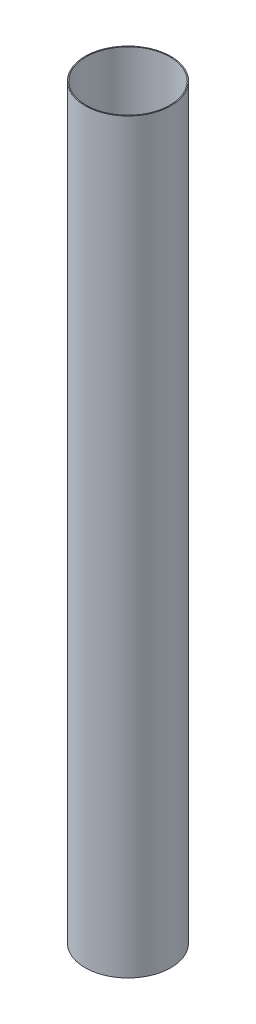
ISO-10303-21;
HEADER;
FILE_DESCRIPTION(('STEP AP214'),'2;1');
FILE_NAME('part.step','',(''),(''),'','','');
FILE_SCHEMA(('AUTOMOTIVE_DESIGN { 1 0 10303 214 1 1 1 1 }'));
ENDSEC;
DATA;
#1=APPLICATION_CONTEXT('core data for automotive mechanical design processes');
#2=APPLICATION_PROTOCOL_DEFINITION('international standard','automotive_design',2000,#1);
#3=PRODUCT_CONTEXT('',#1,'mechanical');
#4=PRODUCT('Part','Part','',(#3));
#5=PRODUCT_RELATED_PRODUCT_CATEGORY('part','',(#4));
#6=PRODUCT_DEFINITION_FORMATION('','',#4);
#7=PRODUCT_DEFINITION_CONTEXT('part definition',#1,'design');
#8=PRODUCT_DEFINITION('design','',#6,#7);
#9=PRODUCT_DEFINITION_SHAPE('','',#8);
#10=(LENGTH_UNIT() NAMED_UNIT(*) SI_UNIT(.MILLI.,.METRE.));
#11=(NAMED_UNIT(*) PLANE_ANGLE_UNIT() SI_UNIT($,.RADIAN.));
#12=(NAMED_UNIT(*) SI_UNIT($,.STERADIAN.) SOLID_ANGLE_UNIT());
#13=UNCERTAINTY_MEASURE_WITH_UNIT(LENGTH_MEASURE(1.E-05),#10,'distance_accuracy_value','');
#14=(GEOMETRIC_REPRESENTATION_CONTEXT(3) GLOBAL_UNCERTAINTY_ASSIGNED_CONTEXT((#13)) GLOBAL_UNIT_ASSIGNED_CONTEXT((#10,
#11,#12)) REPRESENTATION_CONTEXT('',''));
#15=CARTESIAN_POINT('',(0.,0.,0.));
#16=DIRECTION('',(0.,0.,1.));
#17=DIRECTION('',(1.,0.,0.));
#18=AXIS2_PLACEMENT_3D('',#15,#16,#17);
#19=CARTESIAN_POINT('',(0.,1524.,0.));
#20=DIRECTION('',(0.,1.,0.));
#21=DIRECTION('',(0.,0.,1.));
#22=AXIS2_PLACEMENT_3D('',#19,#20,#21);
#23=PLANE('',#22);
#24=CARTESIAN_POINT('',(0.,1524.,0.));
#25=DIRECTION('',(0.,1.,0.));
#26=DIRECTION('',(0.,0.,1.));
#27=AXIS2_PLACEMENT_3D('',#24,#25,#26);
#28=CIRCLE('',#27,87.5284);
#29=CARTESIAN_POINT('',(0.,1524.,87.5284));
#30=VERTEX_POINT('',#29);
#31=EDGE_CURVE('E10',#30,#30,#28,.T.);
#32=ORIENTED_EDGE('',*,*,#31,.T.);
#33=EDGE_LOOP('',(#32));
#34=FACE_BOUND('',#33,.T.);
#35=CARTESIAN_POINT('',(0.,1524.,0.));
#36=DIRECTION('',(0.,1.,0.));
#37=DIRECTION('',(0.,0.,1.));
#38=AXIS2_PLACEMENT_3D('',#35,#36,#37);
#39=CIRCLE('',#38,85.6234);
#40=CARTESIAN_POINT('',(0.,1524.,85.6234));
#41=VERTEX_POINT('',#40);
#42=EDGE_CURVE('E44',#41,#41,#39,.T.);
#43=ORIENTED_EDGE('',*,*,#42,.F.);
#44=EDGE_LOOP('',(#43));
#45=FACE_BOUND('',#44,.T.);
#46=ADVANCED_FACE('F33',(#34,#45),#23,.T.);
#47=CARTESIAN_POINT('',(0.,0.,0.));
#48=DIRECTION('',(0.,1.,0.));
#49=DIRECTION('',(0.,0.,1.));
#50=AXIS2_PLACEMENT_3D('',#47,#48,#49);
#51=PLANE('',#50);
#52=CARTESIAN_POINT('',(0.,0.,0.));
#53=DIRECTION('',(0.,1.,0.));
#54=DIRECTION('',(0.,0.,1.));
#55=AXIS2_PLACEMENT_3D('',#52,#53,#54);
#56=CIRCLE('',#55,87.5284);
#57=CARTESIAN_POINT('',(0.,0.,87.5284));
#58=VERTEX_POINT('',#57);
#59=EDGE_CURVE('E37',#58,#58,#56,.T.);
#60=ORIENTED_EDGE('',*,*,#59,.F.);
#61=EDGE_LOOP('',(#60));
#62=FACE_BOUND('',#61,.T.);
#63=CARTESIAN_POINT('',(0.,0.,0.));
#64=DIRECTION('',(0.,1.,0.));
#65=DIRECTION('',(0.,0.,1.));
#66=AXIS2_PLACEMENT_3D('',#63,#64,#65);
#67=CIRCLE('',#66,85.6234);
#68=CARTESIAN_POINT('',(0.,0.,85.6234));
#69=VERTEX_POINT('',#68);
#70=EDGE_CURVE('E46',#69,#69,#67,.T.);
#71=ORIENTED_EDGE('',*,*,#70,.T.);
#72=EDGE_LOOP('',(#71));
#73=FACE_BOUND('',#72,.T.);
#74=ADVANCED_FACE('F56',(#62,#73),#51,.F.);
#75=CARTESIAN_POINT('',(0.,1524.,0.));
#76=DIRECTION('',(0.,-1.,0.));
#77=DIRECTION('',(0.,0.,-1.));
#78=AXIS2_PLACEMENT_3D('',#75,#76,#77);
#79=CYLINDRICAL_SURFACE('',#78,87.5284);
#80=ORIENTED_EDGE('',*,*,#31,.F.);
#81=EDGE_LOOP('',(#80));
#82=FACE_BOUND('',#81,.T.);
#83=ORIENTED_EDGE('',*,*,#59,.T.);
#84=EDGE_LOOP('',(#83));
#85=FACE_BOUND('',#84,.T.);
#86=ADVANCED_FACE('F35',(#82,#85),#79,.T.);
#87=CARTESIAN_POINT('',(0.,1524.,0.));
#88=DIRECTION('',(0.,-1.,0.));
#89=DIRECTION('',(0.,0.,-1.));
#90=AXIS2_PLACEMENT_3D('',#87,#88,#89);
#91=CYLINDRICAL_SURFACE('',#90,85.6234);
#92=ORIENTED_EDGE('',*,*,#42,.T.);
#93=EDGE_LOOP('',(#92));
#94=FACE_BOUND('',#93,.T.);
#95=ORIENTED_EDGE('',*,*,#70,.F.);
#96=EDGE_LOOP('',(#95));
#97=FACE_BOUND('',#96,.T.);
#98=ADVANCED_FACE('F52',(#94,#97),#91,.F.);
#99=CLOSED_SHELL('',(#46,#74,#86,#98));
#100=MANIFOLD_SOLID_BREP('B2',#99);
#101=ADVANCED_BREP_SHAPE_REPRESENTATION('',(#18,#100),#14);
#102=SHAPE_DEFINITION_REPRESENTATION(#9,#101);
ENDSEC;
END-ISO-10303-21;
